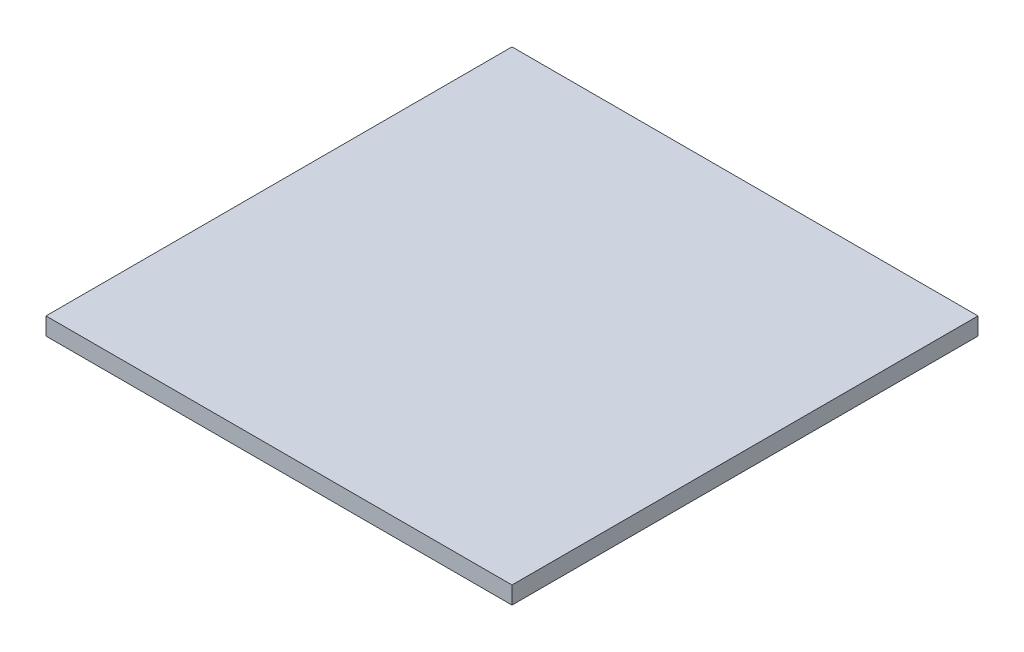
ISO-10303-21;
HEADER;
FILE_DESCRIPTION(('STEP AP214'),'2;1');
FILE_NAME('part.step','',(''),(''),'','','');
FILE_SCHEMA(('AUTOMOTIVE_DESIGN { 1 0 10303 214 1 1 1 1 }'));
ENDSEC;
DATA;
#1=APPLICATION_CONTEXT('core data for automotive mechanical design processes');
#2=APPLICATION_PROTOCOL_DEFINITION('international standard','automotive_design',2000,#1);
#3=PRODUCT_CONTEXT('',#1,'mechanical');
#4=PRODUCT('Part','Part','',(#3));
#5=PRODUCT_RELATED_PRODUCT_CATEGORY('part','',(#4));
#6=PRODUCT_DEFINITION_FORMATION('','',#4);
#7=PRODUCT_DEFINITION_CONTEXT('part definition',#1,'design');
#8=PRODUCT_DEFINITION('design','',#6,#7);
#9=PRODUCT_DEFINITION_SHAPE('','',#8);
#10=(LENGTH_UNIT() NAMED_UNIT(*) SI_UNIT(.MILLI.,.METRE.));
#11=(NAMED_UNIT(*) PLANE_ANGLE_UNIT() SI_UNIT($,.RADIAN.));
#12=(NAMED_UNIT(*) SI_UNIT($,.STERADIAN.) SOLID_ANGLE_UNIT());
#13=UNCERTAINTY_MEASURE_WITH_UNIT(LENGTH_MEASURE(1.E-05),#10,'distance_accuracy_value','');
#14=(GEOMETRIC_REPRESENTATION_CONTEXT(3) GLOBAL_UNCERTAINTY_ASSIGNED_CONTEXT((#13)) GLOBAL_UNIT_ASSIGNED_CONTEXT((#10,
#11,#12)) REPRESENTATION_CONTEXT('',''));
#15=CARTESIAN_POINT('',(0.,0.,0.));
#16=DIRECTION('',(0.,0.,1.));
#17=DIRECTION('',(1.,0.,0.));
#18=AXIS2_PLACEMENT_3D('',#15,#16,#17);
#19=CARTESIAN_POINT('',(200.,15.,200.));
#20=DIRECTION('',(-1.,0.,0.));
#21=DIRECTION('',(0.,0.,1.));
#22=AXIS2_PLACEMENT_3D('',#19,#20,#21);
#23=PLANE('',#22);
#24=DIRECTION('',(0.,0.,-1.));
#25=VECTOR('',#24,1.);
#26=CARTESIAN_POINT('',(200.,0.,200.));
#27=LINE('',#26,#25);
#28=CARTESIAN_POINT('',(200.,0.,200.));
#29=VERTEX_POINT('',#28);
#30=CARTESIAN_POINT('',(200.,0.,-200.));
#31=VERTEX_POINT('',#30);
#32=EDGE_CURVE('E117',#29,#31,#27,.T.);
#33=ORIENTED_EDGE('',*,*,#32,.T.);
#34=DIRECTION('',(0.,-1.,0.));
#35=VECTOR('',#34,1.);
#36=CARTESIAN_POINT('',(200.,15.,-200.));
#37=LINE('',#36,#35);
#38=CARTESIAN_POINT('',(200.,15.,-200.));
#39=VERTEX_POINT('',#38);
#40=EDGE_CURVE('E11',#39,#31,#37,.T.);
#41=ORIENTED_EDGE('',*,*,#40,.F.);
#42=DIRECTION('',(0.,0.,-1.));
#43=VECTOR('',#42,1.);
#44=CARTESIAN_POINT('',(200.,15.,200.));
#45=LINE('',#44,#43);
#46=CARTESIAN_POINT('',(200.,15.,200.));
#47=VERTEX_POINT('',#46);
#48=EDGE_CURVE('E101',#47,#39,#45,.T.);
#49=ORIENTED_EDGE('',*,*,#48,.F.);
#50=DIRECTION('',(0.,-1.,0.));
#51=VECTOR('',#50,1.);
#52=CARTESIAN_POINT('',(200.,15.,200.));
#53=LINE('',#52,#51);
#54=EDGE_CURVE('E113',#47,#29,#53,.T.);
#55=ORIENTED_EDGE('',*,*,#54,.T.);
#56=EDGE_LOOP('',(#33,#41,#49,#55));
#57=FACE_BOUND('',#56,.T.);
#58=ADVANCED_FACE('F49',(#57),#23,.F.);
#59=CARTESIAN_POINT('',(-200.,15.,-200.));
#60=DIRECTION('',(0.,0.,1.));
#61=DIRECTION('',(1.,0.,0.));
#62=AXIS2_PLACEMENT_3D('',#59,#60,#61);
#63=PLANE('',#62);
#64=DIRECTION('',(-1.,0.,0.));
#65=VECTOR('',#64,1.);
#66=CARTESIAN_POINT('',(-200.,0.,-200.));
#67=LINE('',#66,#65);
#68=CARTESIAN_POINT('',(-200.,0.,-200.));
#69=VERTEX_POINT('',#68);
#70=EDGE_CURVE('E106',#31,#69,#67,.T.);
#71=ORIENTED_EDGE('',*,*,#70,.T.);
#72=DIRECTION('',(0.,-1.,0.));
#73=VECTOR('',#72,1.);
#74=CARTESIAN_POINT('',(-200.,15.,-200.));
#75=LINE('',#74,#73);
#76=CARTESIAN_POINT('',(-200.,15.,-200.));
#77=VERTEX_POINT('',#76);
#78=EDGE_CURVE('E58',#77,#69,#75,.T.);
#79=ORIENTED_EDGE('',*,*,#78,.F.);
#80=DIRECTION('',(-1.,0.,0.));
#81=VECTOR('',#80,1.);
#82=CARTESIAN_POINT('',(-200.,15.,-200.));
#83=LINE('',#82,#81);
#84=EDGE_CURVE('E96',#39,#77,#83,.T.);
#85=ORIENTED_EDGE('',*,*,#84,.F.);
#86=ORIENTED_EDGE('',*,*,#40,.T.);
#87=EDGE_LOOP('',(#71,#79,#85,#86));
#88=FACE_BOUND('',#87,.T.);
#89=ADVANCED_FACE('F105',(#88),#63,.F.);
#90=CARTESIAN_POINT('',(-200.,15.,200.));
#91=DIRECTION('',(1.,0.,0.));
#92=DIRECTION('',(0.,0.,-1.));
#93=AXIS2_PLACEMENT_3D('',#90,#91,#92);
#94=PLANE('',#93);
#95=DIRECTION('',(0.,0.,1.));
#96=VECTOR('',#95,1.);
#97=CARTESIAN_POINT('',(-200.,0.,200.));
#98=LINE('',#97,#96);
#99=CARTESIAN_POINT('',(-200.,0.,200.));
#100=VERTEX_POINT('',#99);
#101=EDGE_CURVE('E83',#69,#100,#98,.T.);
#102=ORIENTED_EDGE('',*,*,#101,.T.);
#103=DIRECTION('',(0.,-1.,0.));
#104=VECTOR('',#103,1.);
#105=CARTESIAN_POINT('',(-200.,15.,200.));
#106=LINE('',#105,#104);
#107=CARTESIAN_POINT('',(-200.,15.,200.));
#108=VERTEX_POINT('',#107);
#109=EDGE_CURVE('E108',#108,#100,#106,.T.);
#110=ORIENTED_EDGE('',*,*,#109,.F.);
#111=DIRECTION('',(0.,0.,1.));
#112=VECTOR('',#111,1.);
#113=CARTESIAN_POINT('',(-200.,15.,200.));
#114=LINE('',#113,#112);
#115=EDGE_CURVE('E99',#77,#108,#114,.T.);
#116=ORIENTED_EDGE('',*,*,#115,.F.);
#117=ORIENTED_EDGE('',*,*,#78,.T.);
#118=EDGE_LOOP('',(#102,#110,#116,#117));
#119=FACE_BOUND('',#118,.T.);
#120=ADVANCED_FACE('F109',(#119),#94,.F.);
#121=CARTESIAN_POINT('',(-200.,15.,200.));
#122=DIRECTION('',(0.,0.,-1.));
#123=DIRECTION('',(-1.,0.,0.));
#124=AXIS2_PLACEMENT_3D('',#121,#122,#123);
#125=PLANE('',#124);
#126=DIRECTION('',(1.,0.,0.));
#127=VECTOR('',#126,1.);
#128=CARTESIAN_POINT('',(-200.,0.,200.));
#129=LINE('',#128,#127);
#130=EDGE_CURVE('E89',#100,#29,#129,.T.);
#131=ORIENTED_EDGE('',*,*,#130,.T.);
#132=ORIENTED_EDGE('',*,*,#54,.F.);
#133=DIRECTION('',(1.,0.,0.));
#134=VECTOR('',#133,1.);
#135=CARTESIAN_POINT('',(-200.,15.,200.));
#136=LINE('',#135,#134);
#137=EDGE_CURVE('E66',#108,#47,#136,.T.);
#138=ORIENTED_EDGE('',*,*,#137,.F.);
#139=ORIENTED_EDGE('',*,*,#109,.T.);
#140=EDGE_LOOP('',(#131,#132,#138,#139));
#141=FACE_BOUND('',#140,.T.);
#142=ADVANCED_FACE('F130',(#141),#125,.F.);
#143=CARTESIAN_POINT('',(0.,15.,0.));
#144=DIRECTION('',(0.,-1.,0.));
#145=DIRECTION('',(0.,0.,-1.));
#146=AXIS2_PLACEMENT_3D('',#143,#144,#145);
#147=PLANE('',#146);
#148=ORIENTED_EDGE('',*,*,#48,.T.);
#149=ORIENTED_EDGE('',*,*,#84,.T.);
#150=ORIENTED_EDGE('',*,*,#115,.T.);
#151=ORIENTED_EDGE('',*,*,#137,.T.);
#152=EDGE_LOOP('',(#148,#149,#150,#151));
#153=FACE_BOUND('',#152,.T.);
#154=ADVANCED_FACE('F97',(#153),#147,.F.);
#155=CARTESIAN_POINT('',(0.,0.,0.));
#156=DIRECTION('',(0.,-1.,0.));
#157=DIRECTION('',(0.,0.,-1.));
#158=AXIS2_PLACEMENT_3D('',#155,#156,#157);
#159=PLANE('',#158);
#160=ORIENTED_EDGE('',*,*,#32,.F.);
#161=ORIENTED_EDGE('',*,*,#130,.F.);
#162=ORIENTED_EDGE('',*,*,#101,.F.);
#163=ORIENTED_EDGE('',*,*,#70,.F.);
#164=EDGE_LOOP('',(#160,#161,#162,#163));
#165=FACE_BOUND('',#164,.T.);
#166=ADVANCED_FACE('F133',(#165),#159,.T.);
#167=CLOSED_SHELL('',(#58,#89,#120,#142,#154,#166));
#168=MANIFOLD_SOLID_BREP('B2',#167);
#169=ADVANCED_BREP_SHAPE_REPRESENTATION('',(#18,#168),#14);
#170=SHAPE_DEFINITION_REPRESENTATION(#9,#169);
ENDSEC;
END-ISO-10303-21;
